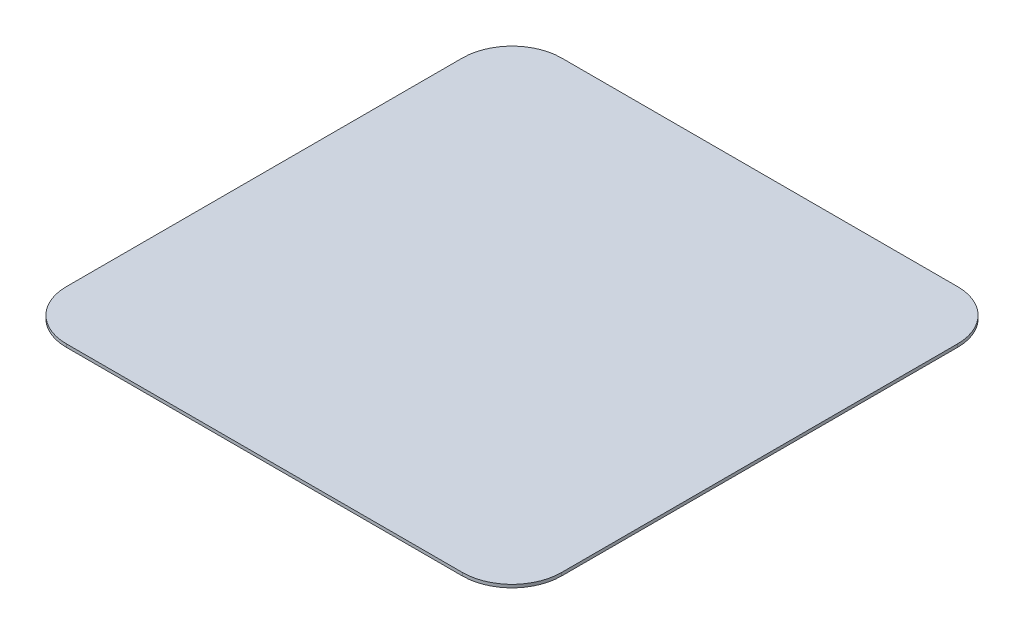
ISO-10303-21;
HEADER;
FILE_DESCRIPTION(('STEP AP214'),'2;1');
FILE_NAME('part.step','',(''),(''),'','','');
FILE_SCHEMA(('AUTOMOTIVE_DESIGN { 1 0 10303 214 1 1 1 1 }'));
ENDSEC;
DATA;
#1=APPLICATION_CONTEXT('core data for automotive mechanical design processes');
#2=APPLICATION_PROTOCOL_DEFINITION('international standard','automotive_design',2000,#1);
#3=PRODUCT_CONTEXT('',#1,'mechanical');
#4=PRODUCT('Part','Part','',(#3));
#5=PRODUCT_RELATED_PRODUCT_CATEGORY('part','',(#4));
#6=PRODUCT_DEFINITION_FORMATION('','',#4);
#7=PRODUCT_DEFINITION_CONTEXT('part definition',#1,'design');
#8=PRODUCT_DEFINITION('design','',#6,#7);
#9=PRODUCT_DEFINITION_SHAPE('','',#8);
#10=(LENGTH_UNIT() NAMED_UNIT(*) SI_UNIT(.MILLI.,.METRE.));
#11=(NAMED_UNIT(*) PLANE_ANGLE_UNIT() SI_UNIT($,.RADIAN.));
#12=(NAMED_UNIT(*) SI_UNIT($,.STERADIAN.) SOLID_ANGLE_UNIT());
#13=UNCERTAINTY_MEASURE_WITH_UNIT(LENGTH_MEASURE(1.E-05),#10,'distance_accuracy_value','');
#14=(GEOMETRIC_REPRESENTATION_CONTEXT(3) GLOBAL_UNCERTAINTY_ASSIGNED_CONTEXT((#13)) GLOBAL_UNIT_ASSIGNED_CONTEXT((#10,
#11,#12)) REPRESENTATION_CONTEXT('',''));
#15=CARTESIAN_POINT('',(0.,0.,0.));
#16=DIRECTION('',(0.,0.,1.));
#17=DIRECTION('',(1.,0.,0.));
#18=AXIS2_PLACEMENT_3D('',#15,#16,#17);
#19=CARTESIAN_POINT('',(50.8,-3.44169999999997,50.8));
#20=DIRECTION('',(0.,1.,0.));
#21=DIRECTION('',(0.,0.,1.));
#22=AXIS2_PLACEMENT_3D('',#19,#20,#21);
#23=CYLINDRICAL_SURFACE('',#22,12.7);
#24=CARTESIAN_POINT('',(50.8,-2.64794999999997,50.8));
#25=DIRECTION('',(0.,-1.,0.));
#26=DIRECTION('',(0.,0.,-1.));
#27=AXIS2_PLACEMENT_3D('',#24,#25,#26);
#28=CIRCLE('',#27,12.7);
#29=CARTESIAN_POINT('',(63.5,-2.64794999999997,50.8));
#30=VERTEX_POINT('',#29);
#31=CARTESIAN_POINT('',(50.7999999999999,-2.64794999999997,63.5));
#32=VERTEX_POINT('',#31);
#33=EDGE_CURVE('E129',#30,#32,#28,.T.);
#34=ORIENTED_EDGE('',*,*,#33,.T.);
#35=DIRECTION('',(0.,1.,0.));
#36=VECTOR('',#35,1.);
#37=CARTESIAN_POINT('',(50.7999999999999,-3.44169999999997,63.5));
#38=LINE('',#37,#36);
#39=CARTESIAN_POINT('',(50.7999999999999,-3.44169999999997,63.5));
#40=VERTEX_POINT('',#39);
#41=EDGE_CURVE('E11',#40,#32,#38,.T.);
#42=ORIENTED_EDGE('',*,*,#41,.F.);
#43=CARTESIAN_POINT('',(50.8,-3.44169999999997,50.8));
#44=DIRECTION('',(0.,-1.,0.));
#45=DIRECTION('',(0.,0.,-1.));
#46=AXIS2_PLACEMENT_3D('',#43,#44,#45);
#47=CIRCLE('',#46,12.7);
#48=CARTESIAN_POINT('',(63.5,-3.44169999999997,50.8));
#49=VERTEX_POINT('',#48);
#50=EDGE_CURVE('E143',#49,#40,#47,.T.);
#51=ORIENTED_EDGE('',*,*,#50,.F.);
#52=DIRECTION('',(0.,1.,0.));
#53=VECTOR('',#52,1.);
#54=CARTESIAN_POINT('',(63.5,-3.44169999999997,50.8));
#55=LINE('',#54,#53);
#56=EDGE_CURVE('E125',#49,#30,#55,.T.);
#57=ORIENTED_EDGE('',*,*,#56,.T.);
#58=EDGE_LOOP('',(#34,#42,#51,#57));
#59=FACE_BOUND('',#58,.T.);
#60=ADVANCED_FACE('F33',(#59),#23,.T.);
#61=CARTESIAN_POINT('',(50.7999999999999,-3.44169999999997,63.5));
#62=DIRECTION('',(0.,0.,-1.));
#63=DIRECTION('',(-1.,0.,0.));
#64=AXIS2_PLACEMENT_3D('',#61,#62,#63);
#65=PLANE('',#64);
#66=DIRECTION('',(-1.,0.,0.));
#67=VECTOR('',#66,1.);
#68=CARTESIAN_POINT('',(50.7999999999999,-2.64794999999997,63.5));
#69=LINE('',#68,#67);
#70=CARTESIAN_POINT('',(-50.8,-2.64794999999997,63.5));
#71=VERTEX_POINT('',#70);
#72=EDGE_CURVE('E132',#32,#71,#69,.T.);
#73=ORIENTED_EDGE('',*,*,#72,.T.);
#74=DIRECTION('',(0.,1.,0.));
#75=VECTOR('',#74,1.);
#76=CARTESIAN_POINT('',(-50.8,-3.44169999999997,63.5));
#77=LINE('',#76,#75);
#78=CARTESIAN_POINT('',(-50.8,-3.44169999999997,63.5));
#79=VERTEX_POINT('',#78);
#80=EDGE_CURVE('E41',#79,#71,#77,.T.);
#81=ORIENTED_EDGE('',*,*,#80,.F.);
#82=DIRECTION('',(-1.,0.,0.));
#83=VECTOR('',#82,1.);
#84=CARTESIAN_POINT('',(50.7999999999999,-3.44169999999997,63.5));
#85=LINE('',#84,#83);
#86=EDGE_CURVE('E92',#40,#79,#85,.T.);
#87=ORIENTED_EDGE('',*,*,#86,.F.);
#88=ORIENTED_EDGE('',*,*,#41,.T.);
#89=EDGE_LOOP('',(#73,#81,#87,#88));
#90=FACE_BOUND('',#89,.T.);
#91=ADVANCED_FACE('F178',(#90),#65,.F.);
#92=CARTESIAN_POINT('',(-50.8,-3.44169999999997,50.8));
#93=DIRECTION('',(0.,1.,0.));
#94=DIRECTION('',(0.,0.,1.));
#95=AXIS2_PLACEMENT_3D('',#92,#93,#94);
#96=CYLINDRICAL_SURFACE('',#95,12.7);
#97=CARTESIAN_POINT('',(-50.8,-2.64794999999997,50.8));
#98=DIRECTION('',(0.,-1.,0.));
#99=DIRECTION('',(0.,0.,-1.));
#100=AXIS2_PLACEMENT_3D('',#97,#98,#99);
#101=CIRCLE('',#100,12.7);
#102=CARTESIAN_POINT('',(-63.4999999999999,-2.64794999999997,50.8));
#103=VERTEX_POINT('',#102);
#104=EDGE_CURVE('E134',#71,#103,#101,.T.);
#105=ORIENTED_EDGE('',*,*,#104,.T.);
#106=DIRECTION('',(0.,1.,0.));
#107=VECTOR('',#106,1.);
#108=CARTESIAN_POINT('',(-63.4999999999999,-3.44169999999997,50.8));
#109=LINE('',#108,#107);
#110=CARTESIAN_POINT('',(-63.4999999999999,-3.44169999999997,50.8));
#111=VERTEX_POINT('',#110);
#112=EDGE_CURVE('E150',#111,#103,#109,.T.);
#113=ORIENTED_EDGE('',*,*,#112,.F.);
#114=CARTESIAN_POINT('',(-50.8,-3.44169999999997,50.8));
#115=DIRECTION('',(0.,-1.,0.));
#116=DIRECTION('',(0.,0.,-1.));
#117=AXIS2_PLACEMENT_3D('',#114,#115,#116);
#118=CIRCLE('',#117,12.7);
#119=EDGE_CURVE('E158',#79,#111,#118,.T.);
#120=ORIENTED_EDGE('',*,*,#119,.F.);
#121=ORIENTED_EDGE('',*,*,#80,.T.);
#122=EDGE_LOOP('',(#105,#113,#120,#121));
#123=FACE_BOUND('',#122,.T.);
#124=ADVANCED_FACE('F156',(#123),#96,.T.);
#125=CARTESIAN_POINT('',(-63.4999999999999,-3.44169999999997,50.8));
#126=DIRECTION('',(1.,0.,0.));
#127=DIRECTION('',(0.,0.,-1.));
#128=AXIS2_PLACEMENT_3D('',#125,#126,#127);
#129=PLANE('',#128);
#130=DIRECTION('',(0.,0.,-1.));
#131=VECTOR('',#130,1.);
#132=CARTESIAN_POINT('',(-63.4999999999999,-2.64794999999997,50.8));
#133=LINE('',#132,#131);
#134=CARTESIAN_POINT('',(-63.4999999999999,-2.64794999999997,-50.8));
#135=VERTEX_POINT('',#134);
#136=EDGE_CURVE('E136',#103,#135,#133,.T.);
#137=ORIENTED_EDGE('',*,*,#136,.T.);
#138=DIRECTION('',(0.,1.,0.));
#139=VECTOR('',#138,1.);
#140=CARTESIAN_POINT('',(-63.4999999999999,-3.44169999999997,-50.8));
#141=LINE('',#140,#139);
#142=CARTESIAN_POINT('',(-63.4999999999999,-3.44169999999997,-50.8));
#143=VERTEX_POINT('',#142);
#144=EDGE_CURVE('E147',#143,#135,#141,.T.);
#145=ORIENTED_EDGE('',*,*,#144,.F.);
#146=DIRECTION('',(0.,0.,-1.));
#147=VECTOR('',#146,1.);
#148=CARTESIAN_POINT('',(-63.4999999999999,-3.44169999999997,50.8));
#149=LINE('',#148,#147);
#150=EDGE_CURVE('E170',#111,#143,#149,.T.);
#151=ORIENTED_EDGE('',*,*,#150,.F.);
#152=ORIENTED_EDGE('',*,*,#112,.T.);
#153=EDGE_LOOP('',(#137,#145,#151,#152));
#154=FACE_BOUND('',#153,.T.);
#155=ADVANCED_FACE('F166',(#154),#129,.F.);
#156=CARTESIAN_POINT('',(-50.7999999999999,-3.44169999999997,-50.8));
#157=DIRECTION('',(0.,1.,0.));
#158=DIRECTION('',(0.,0.,1.));
#159=AXIS2_PLACEMENT_3D('',#156,#157,#158);
#160=CYLINDRICAL_SURFACE('',#159,12.7);
#161=CARTESIAN_POINT('',(-50.7999999999999,-2.64794999999997,-50.8));
#162=DIRECTION('',(0.,-1.,0.));
#163=DIRECTION('',(0.,0.,-1.));
#164=AXIS2_PLACEMENT_3D('',#161,#162,#163);
#165=CIRCLE('',#164,12.7);
#166=CARTESIAN_POINT('',(-50.7999999999999,-2.64794999999997,-63.5));
#167=VERTEX_POINT('',#166);
#168=EDGE_CURVE('E138',#135,#167,#165,.T.);
#169=ORIENTED_EDGE('',*,*,#168,.T.);
#170=DIRECTION('',(0.,1.,0.));
#171=VECTOR('',#170,1.);
#172=CARTESIAN_POINT('',(-50.7999999999999,-3.44169999999997,-63.5));
#173=LINE('',#172,#171);
#174=CARTESIAN_POINT('',(-50.7999999999999,-3.44169999999997,-63.5));
#175=VERTEX_POINT('',#174);
#176=EDGE_CURVE('E120',#175,#167,#173,.T.);
#177=ORIENTED_EDGE('',*,*,#176,.F.);
#178=CARTESIAN_POINT('',(-50.7999999999999,-3.44169999999997,-50.8));
#179=DIRECTION('',(0.,-1.,0.));
#180=DIRECTION('',(0.,0.,-1.));
#181=AXIS2_PLACEMENT_3D('',#178,#179,#180);
#182=CIRCLE('',#181,12.7);
#183=EDGE_CURVE('E111',#143,#175,#182,.T.);
#184=ORIENTED_EDGE('',*,*,#183,.F.);
#185=ORIENTED_EDGE('',*,*,#144,.T.);
#186=EDGE_LOOP('',(#169,#177,#184,#185));
#187=FACE_BOUND('',#186,.T.);
#188=ADVANCED_FACE('F169',(#187),#160,.T.);
#189=CARTESIAN_POINT('',(-50.7999999999999,-3.44169999999997,-63.5));
#190=DIRECTION('',(0.,0.,1.));
#191=DIRECTION('',(1.,0.,0.));
#192=AXIS2_PLACEMENT_3D('',#189,#190,#191);
#193=PLANE('',#192);
#194=DIRECTION('',(1.,0.,0.));
#195=VECTOR('',#194,1.);
#196=CARTESIAN_POINT('',(-50.7999999999999,-2.64794999999997,-63.5));
#197=LINE('',#196,#195);
#198=CARTESIAN_POINT('',(50.8,-2.64794999999997,-63.5000000000001));
#199=VERTEX_POINT('',#198);
#200=EDGE_CURVE('E119',#167,#199,#197,.T.);
#201=ORIENTED_EDGE('',*,*,#200,.T.);
#202=DIRECTION('',(0.,1.,0.));
#203=VECTOR('',#202,1.);
#204=CARTESIAN_POINT('',(50.8,-3.44169999999997,-63.5000000000001));
#205=LINE('',#204,#203);
#206=CARTESIAN_POINT('',(50.8,-3.44169999999997,-63.5000000000001));
#207=VERTEX_POINT('',#206);
#208=EDGE_CURVE('E116',#207,#199,#205,.T.);
#209=ORIENTED_EDGE('',*,*,#208,.F.);
#210=DIRECTION('',(1.,0.,0.));
#211=VECTOR('',#210,1.);
#212=CARTESIAN_POINT('',(-50.7999999999999,-3.44169999999997,-63.5));
#213=LINE('',#212,#211);
#214=EDGE_CURVE('E105',#175,#207,#213,.T.);
#215=ORIENTED_EDGE('',*,*,#214,.F.);
#216=ORIENTED_EDGE('',*,*,#176,.T.);
#217=EDGE_LOOP('',(#201,#209,#215,#216));
#218=FACE_BOUND('',#217,.T.);
#219=ADVANCED_FACE('F117',(#218),#193,.F.);
#220=CARTESIAN_POINT('',(50.8,-3.44169999999997,-50.8));
#221=DIRECTION('',(0.,1.,0.));
#222=DIRECTION('',(0.,0.,1.));
#223=AXIS2_PLACEMENT_3D('',#220,#221,#222);
#224=CYLINDRICAL_SURFACE('',#223,12.7);
#225=CARTESIAN_POINT('',(50.8,-2.64794999999997,-50.8));
#226=DIRECTION('',(0.,-1.,0.));
#227=DIRECTION('',(0.,0.,-1.));
#228=AXIS2_PLACEMENT_3D('',#225,#226,#227);
#229=CIRCLE('',#228,12.7);
#230=CARTESIAN_POINT('',(63.5,-2.64794999999997,-50.8));
#231=VERTEX_POINT('',#230);
#232=EDGE_CURVE('E78',#199,#231,#229,.T.);
#233=ORIENTED_EDGE('',*,*,#232,.T.);
#234=DIRECTION('',(0.,1.,0.));
#235=VECTOR('',#234,1.);
#236=CARTESIAN_POINT('',(63.5,-3.44169999999997,-50.8));
#237=LINE('',#236,#235);
#238=CARTESIAN_POINT('',(63.5,-3.44169999999997,-50.8));
#239=VERTEX_POINT('',#238);
#240=EDGE_CURVE('E121',#239,#231,#237,.T.);
#241=ORIENTED_EDGE('',*,*,#240,.F.);
#242=CARTESIAN_POINT('',(50.8,-3.44169999999997,-50.8));
#243=DIRECTION('',(0.,-1.,0.));
#244=DIRECTION('',(0.,0.,-1.));
#245=AXIS2_PLACEMENT_3D('',#242,#243,#244);
#246=CIRCLE('',#245,12.7);
#247=EDGE_CURVE('E109',#207,#239,#246,.T.);
#248=ORIENTED_EDGE('',*,*,#247,.F.);
#249=ORIENTED_EDGE('',*,*,#208,.T.);
#250=EDGE_LOOP('',(#233,#241,#248,#249));
#251=FACE_BOUND('',#250,.T.);
#252=ADVANCED_FACE('F123',(#251),#224,.T.);
#253=CARTESIAN_POINT('',(63.5,-3.44169999999997,-50.8));
#254=DIRECTION('',(-1.,0.,0.));
#255=DIRECTION('',(0.,0.,1.));
#256=AXIS2_PLACEMENT_3D('',#253,#254,#255);
#257=PLANE('',#256);
#258=DIRECTION('',(0.,0.,1.));
#259=VECTOR('',#258,1.);
#260=CARTESIAN_POINT('',(63.5,-2.64794999999997,-50.8));
#261=LINE('',#260,#259);
#262=EDGE_CURVE('E84',#231,#30,#261,.T.);
#263=ORIENTED_EDGE('',*,*,#262,.T.);
#264=ORIENTED_EDGE('',*,*,#56,.F.);
#265=DIRECTION('',(0.,0.,1.));
#266=VECTOR('',#265,1.);
#267=CARTESIAN_POINT('',(63.5,-3.44169999999997,-50.8));
#268=LINE('',#267,#266);
#269=EDGE_CURVE('E49',#239,#49,#268,.T.);
#270=ORIENTED_EDGE('',*,*,#269,.F.);
#271=ORIENTED_EDGE('',*,*,#240,.T.);
#272=EDGE_LOOP('',(#263,#264,#270,#271));
#273=FACE_BOUND('',#272,.T.);
#274=ADVANCED_FACE('F194',(#273),#257,.F.);
#275=CARTESIAN_POINT('',(50.8,-3.44169999999997,50.8));
#276=DIRECTION('',(0.,-1.,0.));
#277=DIRECTION('',(0.,0.,-1.));
#278=AXIS2_PLACEMENT_3D('',#275,#276,#277);
#279=PLANE('',#278);
#280=ORIENTED_EDGE('',*,*,#50,.T.);
#281=ORIENTED_EDGE('',*,*,#86,.T.);
#282=ORIENTED_EDGE('',*,*,#119,.T.);
#283=ORIENTED_EDGE('',*,*,#150,.T.);
#284=ORIENTED_EDGE('',*,*,#183,.T.);
#285=ORIENTED_EDGE('',*,*,#214,.T.);
#286=ORIENTED_EDGE('',*,*,#247,.T.);
#287=ORIENTED_EDGE('',*,*,#269,.T.);
#288=EDGE_LOOP('',(#280,#281,#282,#283,#284,#285,#286,#287));
#289=FACE_BOUND('',#288,.T.);
#290=ADVANCED_FACE('F107',(#289),#279,.T.);
#291=CARTESIAN_POINT('',(50.8,-2.64794999999997,50.8));
#292=DIRECTION('',(0.,-1.,0.));
#293=DIRECTION('',(0.,0.,-1.));
#294=AXIS2_PLACEMENT_3D('',#291,#292,#293);
#295=PLANE('',#294);
#296=ORIENTED_EDGE('',*,*,#33,.F.);
#297=ORIENTED_EDGE('',*,*,#262,.F.);
#298=ORIENTED_EDGE('',*,*,#232,.F.);
#299=ORIENTED_EDGE('',*,*,#200,.F.);
#300=ORIENTED_EDGE('',*,*,#168,.F.);
#301=ORIENTED_EDGE('',*,*,#136,.F.);
#302=ORIENTED_EDGE('',*,*,#104,.F.);
#303=ORIENTED_EDGE('',*,*,#72,.F.);
#304=EDGE_LOOP('',(#296,#297,#298,#299,#300,#301,#302,#303));
#305=FACE_BOUND('',#304,.T.);
#306=ADVANCED_FACE('F162',(#305),#295,.F.);
#307=CLOSED_SHELL('',(#60,#91,#124,#155,#188,#219,#252,#274,#290,#306));
#308=MANIFOLD_SOLID_BREP('B2',#307);
#309=ADVANCED_BREP_SHAPE_REPRESENTATION('',(#18,#308),#14);
#310=SHAPE_DEFINITION_REPRESENTATION(#9,#309);
ENDSEC;
END-ISO-10303-21;
